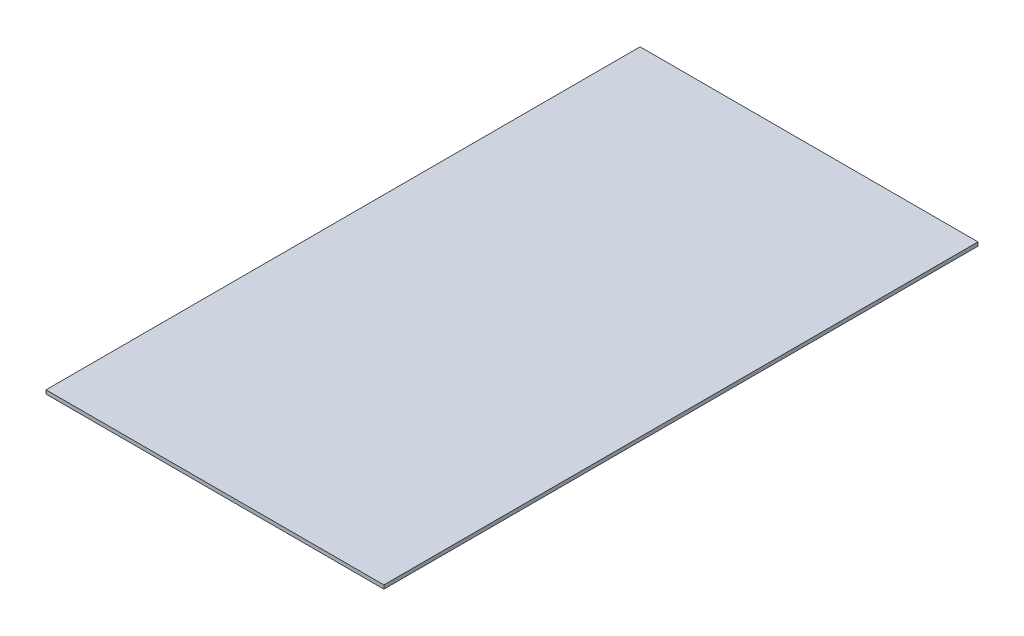
ISO-10303-21;
HEADER;
FILE_DESCRIPTION(('STEP AP214'),'2;1');
FILE_NAME('part.step','',(''),(''),'','','');
FILE_SCHEMA(('AUTOMOTIVE_DESIGN { 1 0 10303 214 1 1 1 1 }'));
ENDSEC;
DATA;
#1=APPLICATION_CONTEXT('core data for automotive mechanical design processes');
#2=APPLICATION_PROTOCOL_DEFINITION('international standard','automotive_design',2000,#1);
#3=PRODUCT_CONTEXT('',#1,'mechanical');
#4=PRODUCT('Part','Part','',(#3));
#5=PRODUCT_RELATED_PRODUCT_CATEGORY('part','',(#4));
#6=PRODUCT_DEFINITION_FORMATION('','',#4);
#7=PRODUCT_DEFINITION_CONTEXT('part definition',#1,'design');
#8=PRODUCT_DEFINITION('design','',#6,#7);
#9=PRODUCT_DEFINITION_SHAPE('','',#8);
#10=(LENGTH_UNIT() NAMED_UNIT(*) SI_UNIT(.MILLI.,.METRE.));
#11=(NAMED_UNIT(*) PLANE_ANGLE_UNIT() SI_UNIT($,.RADIAN.));
#12=(NAMED_UNIT(*) SI_UNIT($,.STERADIAN.) SOLID_ANGLE_UNIT());
#13=UNCERTAINTY_MEASURE_WITH_UNIT(LENGTH_MEASURE(1.E-05),#10,'distance_accuracy_value','');
#14=(GEOMETRIC_REPRESENTATION_CONTEXT(3) GLOBAL_UNCERTAINTY_ASSIGNED_CONTEXT((#13)) GLOBAL_UNIT_ASSIGNED_CONTEXT((#10,
#11,#12)) REPRESENTATION_CONTEXT('',''));
#15=CARTESIAN_POINT('',(0.,0.,0.));
#16=DIRECTION('',(0.,0.,1.));
#17=DIRECTION('',(1.,0.,0.));
#18=AXIS2_PLACEMENT_3D('',#15,#16,#17);
#19=CARTESIAN_POINT('',(-227.5,5.,-400.));
#20=DIRECTION('',(0.,0.,-1.));
#21=DIRECTION('',(-1.,0.,0.));
#22=AXIS2_PLACEMENT_3D('',#19,#20,#21);
#23=PLANE('',#22);
#24=DIRECTION('',(1.,0.,0.));
#25=VECTOR('',#24,1.);
#26=CARTESIAN_POINT('',(-227.5,0.,-400.));
#27=LINE('',#26,#25);
#28=CARTESIAN_POINT('',(-227.5,0.,-400.));
#29=VERTEX_POINT('',#28);
#30=CARTESIAN_POINT('',(227.5,0.,-400.));
#31=VERTEX_POINT('',#30);
#32=EDGE_CURVE('E98',#29,#31,#27,.T.);
#33=ORIENTED_EDGE('',*,*,#32,.F.);
#34=DIRECTION('',(0.,-1.,0.));
#35=VECTOR('',#34,1.);
#36=CARTESIAN_POINT('',(-227.5,5.,-400.));
#37=LINE('',#36,#35);
#38=CARTESIAN_POINT('',(-227.5,5.,-400.));
#39=VERTEX_POINT('',#38);
#40=EDGE_CURVE('E11',#39,#29,#37,.T.);
#41=ORIENTED_EDGE('',*,*,#40,.F.);
#42=DIRECTION('',(1.,0.,0.));
#43=VECTOR('',#42,1.);
#44=CARTESIAN_POINT('',(-227.5,5.,-400.));
#45=LINE('',#44,#43);
#46=CARTESIAN_POINT('',(227.5,5.,-400.));
#47=VERTEX_POINT('',#46);
#48=EDGE_CURVE('E93',#39,#47,#45,.T.);
#49=ORIENTED_EDGE('',*,*,#48,.T.);
#50=DIRECTION('',(0.,-1.,0.));
#51=VECTOR('',#50,1.);
#52=CARTESIAN_POINT('',(227.5,5.,-400.));
#53=LINE('',#52,#51);
#54=EDGE_CURVE('E36',#47,#31,#53,.T.);
#55=ORIENTED_EDGE('',*,*,#54,.T.);
#56=EDGE_LOOP('',(#33,#41,#49,#55));
#57=FACE_BOUND('',#56,.T.);
#58=ADVANCED_FACE('F33',(#57),#23,.T.);
#59=CARTESIAN_POINT('',(-227.5,5.,-400.));
#60=DIRECTION('',(1.,0.,0.));
#61=DIRECTION('',(0.,0.,-1.));
#62=AXIS2_PLACEMENT_3D('',#59,#60,#61);
#63=PLANE('',#62);
#64=DIRECTION('',(0.,0.,1.));
#65=VECTOR('',#64,1.);
#66=CARTESIAN_POINT('',(-227.5,0.,-400.));
#67=LINE('',#66,#65);
#68=CARTESIAN_POINT('',(-227.5,0.,400.));
#69=VERTEX_POINT('',#68);
#70=EDGE_CURVE('E66',#29,#69,#67,.T.);
#71=ORIENTED_EDGE('',*,*,#70,.T.);
#72=DIRECTION('',(0.,-1.,0.));
#73=VECTOR('',#72,1.);
#74=CARTESIAN_POINT('',(-227.5,5.,400.));
#75=LINE('',#74,#73);
#76=CARTESIAN_POINT('',(-227.5,5.,400.));
#77=VERTEX_POINT('',#76);
#78=EDGE_CURVE('E42',#77,#69,#75,.T.);
#79=ORIENTED_EDGE('',*,*,#78,.F.);
#80=DIRECTION('',(0.,0.,1.));
#81=VECTOR('',#80,1.);
#82=CARTESIAN_POINT('',(-227.5,5.,-400.));
#83=LINE('',#82,#81);
#84=EDGE_CURVE('E83',#39,#77,#83,.T.);
#85=ORIENTED_EDGE('',*,*,#84,.F.);
#86=ORIENTED_EDGE('',*,*,#40,.T.);
#87=EDGE_LOOP('',(#71,#79,#85,#86));
#88=FACE_BOUND('',#87,.T.);
#89=ADVANCED_FACE('F108',(#88),#63,.F.);
#90=CARTESIAN_POINT('',(-227.5,5.,400.));
#91=DIRECTION('',(0.,0.,-1.));
#92=DIRECTION('',(-1.,0.,0.));
#93=AXIS2_PLACEMENT_3D('',#90,#91,#92);
#94=PLANE('',#93);
#95=DIRECTION('',(1.,0.,0.));
#96=VECTOR('',#95,1.);
#97=CARTESIAN_POINT('',(-227.5,0.,400.));
#98=LINE('',#97,#96);
#99=CARTESIAN_POINT('',(227.5,0.,400.));
#100=VERTEX_POINT('',#99);
#101=EDGE_CURVE('E90',#69,#100,#98,.T.);
#102=ORIENTED_EDGE('',*,*,#101,.T.);
#103=DIRECTION('',(0.,-1.,0.));
#104=VECTOR('',#103,1.);
#105=CARTESIAN_POINT('',(227.5,5.,400.));
#106=LINE('',#105,#104);
#107=CARTESIAN_POINT('',(227.5,5.,400.));
#108=VERTEX_POINT('',#107);
#109=EDGE_CURVE('E87',#108,#100,#106,.T.);
#110=ORIENTED_EDGE('',*,*,#109,.F.);
#111=DIRECTION('',(1.,0.,0.));
#112=VECTOR('',#111,1.);
#113=CARTESIAN_POINT('',(-227.5,5.,400.));
#114=LINE('',#113,#112);
#115=EDGE_CURVE('E78',#77,#108,#114,.T.);
#116=ORIENTED_EDGE('',*,*,#115,.F.);
#117=ORIENTED_EDGE('',*,*,#78,.T.);
#118=EDGE_LOOP('',(#102,#110,#116,#117));
#119=FACE_BOUND('',#118,.T.);
#120=ADVANCED_FACE('F88',(#119),#94,.F.);
#121=CARTESIAN_POINT('',(227.5,5.,-400.));
#122=DIRECTION('',(1.,0.,0.));
#123=DIRECTION('',(0.,0.,-1.));
#124=AXIS2_PLACEMENT_3D('',#121,#122,#123);
#125=PLANE('',#124);
#126=DIRECTION('',(0.,0.,1.));
#127=VECTOR('',#126,1.);
#128=CARTESIAN_POINT('',(227.5,0.,-400.));
#129=LINE('',#128,#127);
#130=EDGE_CURVE('E101',#31,#100,#129,.T.);
#131=ORIENTED_EDGE('',*,*,#130,.F.);
#132=ORIENTED_EDGE('',*,*,#54,.F.);
#133=DIRECTION('',(0.,0.,1.));
#134=VECTOR('',#133,1.);
#135=CARTESIAN_POINT('',(227.5,5.,-400.));
#136=LINE('',#135,#134);
#137=EDGE_CURVE('E82',#47,#108,#136,.T.);
#138=ORIENTED_EDGE('',*,*,#137,.T.);
#139=ORIENTED_EDGE('',*,*,#109,.T.);
#140=EDGE_LOOP('',(#131,#132,#138,#139));
#141=FACE_BOUND('',#140,.T.);
#142=ADVANCED_FACE('F92',(#141),#125,.T.);
#143=CARTESIAN_POINT('',(0.,5.,0.));
#144=DIRECTION('',(0.,-1.,0.));
#145=DIRECTION('',(0.,0.,-1.));
#146=AXIS2_PLACEMENT_3D('',#143,#144,#145);
#147=PLANE('',#146);
#148=ORIENTED_EDGE('',*,*,#48,.F.);
#149=ORIENTED_EDGE('',*,*,#84,.T.);
#150=ORIENTED_EDGE('',*,*,#115,.T.);
#151=ORIENTED_EDGE('',*,*,#137,.F.);
#152=EDGE_LOOP('',(#148,#149,#150,#151));
#153=FACE_BOUND('',#152,.T.);
#154=ADVANCED_FACE('F81',(#153),#147,.F.);
#155=CARTESIAN_POINT('',(0.,0.,0.));
#156=DIRECTION('',(0.,-1.,0.));
#157=DIRECTION('',(0.,0.,-1.));
#158=AXIS2_PLACEMENT_3D('',#155,#156,#157);
#159=PLANE('',#158);
#160=ORIENTED_EDGE('',*,*,#32,.T.);
#161=ORIENTED_EDGE('',*,*,#130,.T.);
#162=ORIENTED_EDGE('',*,*,#101,.F.);
#163=ORIENTED_EDGE('',*,*,#70,.F.);
#164=EDGE_LOOP('',(#160,#161,#162,#163));
#165=FACE_BOUND('',#164,.T.);
#166=ADVANCED_FACE('F106',(#165),#159,.T.);
#167=CLOSED_SHELL('',(#58,#89,#120,#142,#154,#166));
#168=MANIFOLD_SOLID_BREP('B2',#167);
#169=ADVANCED_BREP_SHAPE_REPRESENTATION('',(#18,#168),#14);
#170=SHAPE_DEFINITION_REPRESENTATION(#9,#169);
ENDSEC;
END-ISO-10303-21;
